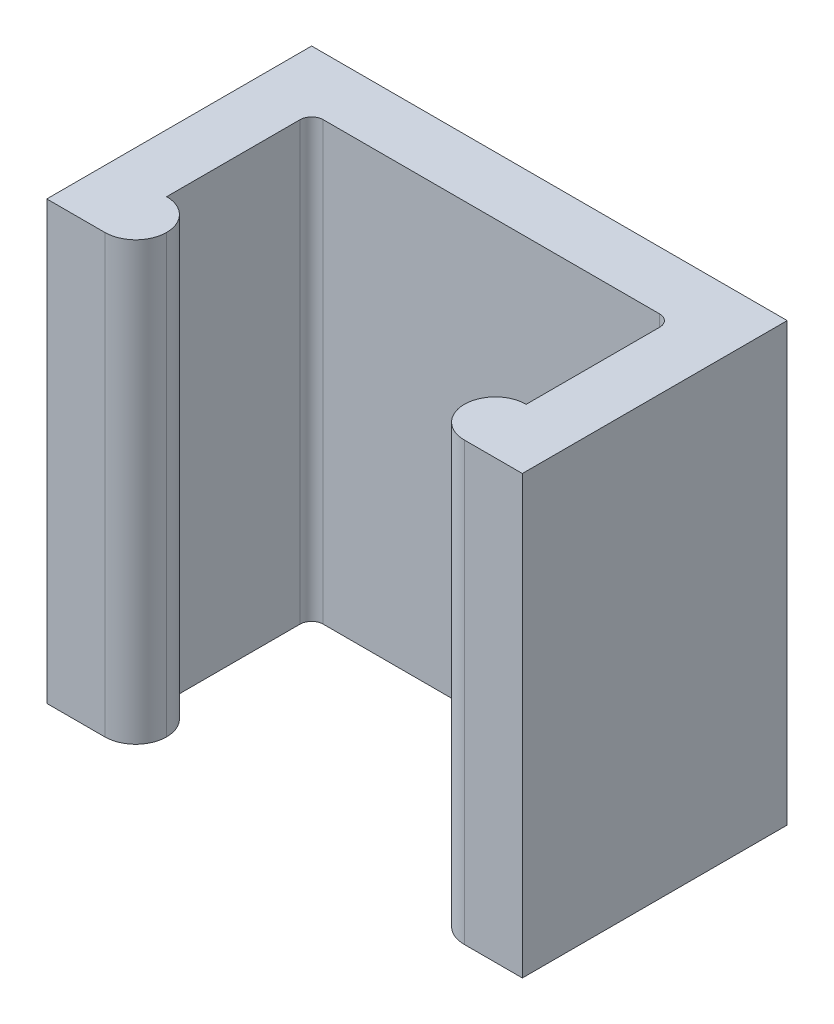
ISO-10303-21;
HEADER;
FILE_DESCRIPTION(('STEP AP214'),'2;1');
FILE_NAME('part.step','',(''),(''),'','','');
FILE_SCHEMA(('AUTOMOTIVE_DESIGN { 1 0 10303 214 1 1 1 1 }'));
ENDSEC;
DATA;
#1=APPLICATION_CONTEXT('core data for automotive mechanical design processes');
#2=APPLICATION_PROTOCOL_DEFINITION('international standard','automotive_design',2000,#1);
#3=PRODUCT_CONTEXT('',#1,'mechanical');
#4=PRODUCT('Part','Part','',(#3));
#5=PRODUCT_RELATED_PRODUCT_CATEGORY('part','',(#4));
#6=PRODUCT_DEFINITION_FORMATION('','',#4);
#7=PRODUCT_DEFINITION_CONTEXT('part definition',#1,'design');
#8=PRODUCT_DEFINITION('design','',#6,#7);
#9=PRODUCT_DEFINITION_SHAPE('','',#8);
#10=(LENGTH_UNIT() NAMED_UNIT(*) SI_UNIT(.MILLI.,.METRE.));
#11=(NAMED_UNIT(*) PLANE_ANGLE_UNIT() SI_UNIT($,.RADIAN.));
#12=(NAMED_UNIT(*) SI_UNIT($,.STERADIAN.) SOLID_ANGLE_UNIT());
#13=UNCERTAINTY_MEASURE_WITH_UNIT(LENGTH_MEASURE(1.E-05),#10,'distance_accuracy_value','');
#14=(GEOMETRIC_REPRESENTATION_CONTEXT(3) GLOBAL_UNCERTAINTY_ASSIGNED_CONTEXT((#13)) GLOBAL_UNIT_ASSIGNED_CONTEXT((#10,
#11,#12)) REPRESENTATION_CONTEXT('',''));
#15=CARTESIAN_POINT('',(0.,0.,0.));
#16=DIRECTION('',(0.,0.,1.));
#17=DIRECTION('',(1.,0.,0.));
#18=AXIS2_PLACEMENT_3D('',#15,#16,#17);
#19=CARTESIAN_POINT('',(4.65,5.65,6.85));
#20=DIRECTION('',(1.,0.,0.));
#21=DIRECTION('',(0.,1.,0.));
#22=AXIS2_PLACEMENT_3D('',#19,#20,#21);
#23=PLANE('',#22);
#24=DIRECTION('',(0.,0.,-1.));
#25=VECTOR('',#24,1.);
#26=CARTESIAN_POINT('',(4.65,5.65,6.85));
#27=LINE('',#26,#25);
#28=CARTESIAN_POINT('',(4.65,5.65,5.25));
#29=VERTEX_POINT('',#28);
#30=CARTESIAN_POINT('',(4.65,5.65,1.8));
#31=VERTEX_POINT('',#30);
#32=EDGE_CURVE('E146',#29,#31,#27,.T.);
#33=ORIENTED_EDGE('',*,*,#32,.T.);
#34=DIRECTION('',(0.,1.,0.));
#35=VECTOR('',#34,1.);
#36=CARTESIAN_POINT('',(4.65,-5.65,1.8));
#37=LINE('',#36,#35);
#38=CARTESIAN_POINT('',(4.65,-5.65,1.8));
#39=VERTEX_POINT('',#38);
#40=EDGE_CURVE('E214',#31,#39,#37,.F.);
#41=ORIENTED_EDGE('',*,*,#40,.T.);
#42=DIRECTION('',(0.,0.,-1.));
#43=VECTOR('',#42,1.);
#44=CARTESIAN_POINT('',(4.65,-5.65,6.85));
#45=LINE('',#44,#43);
#46=CARTESIAN_POINT('',(4.65,-5.65,5.25));
#47=VERTEX_POINT('',#46);
#48=EDGE_CURVE('E149',#47,#39,#45,.T.);
#49=ORIENTED_EDGE('',*,*,#48,.F.);
#50=DIRECTION('',(0.,-1.,0.));
#51=VECTOR('',#50,1.);
#52=CARTESIAN_POINT('',(4.65,-5.65,5.25));
#53=LINE('',#52,#51);
#54=EDGE_CURVE('E144',#29,#47,#53,.T.);
#55=ORIENTED_EDGE('',*,*,#54,.F.);
#56=EDGE_LOOP('',(#33,#41,#49,#55));
#57=FACE_BOUND('',#56,.T.);
#58=ADVANCED_FACE('F41',(#57),#23,.F.);
#59=CARTESIAN_POINT('',(-4.65,5.65,6.85));
#60=DIRECTION('',(-1.,0.,0.));
#61=DIRECTION('',(0.,-1.,0.));
#62=AXIS2_PLACEMENT_3D('',#59,#60,#61);
#63=PLANE('',#62);
#64=DIRECTION('',(0.,0.,-1.));
#65=VECTOR('',#64,1.);
#66=CARTESIAN_POINT('',(-4.65,-5.65,6.85));
#67=LINE('',#66,#65);
#68=CARTESIAN_POINT('',(-4.65,-5.65,5.25));
#69=VERTEX_POINT('',#68);
#70=CARTESIAN_POINT('',(-4.65,-5.65,1.8));
#71=VERTEX_POINT('',#70);
#72=EDGE_CURVE('E326',#69,#71,#67,.T.);
#73=ORIENTED_EDGE('',*,*,#72,.T.);
#74=DIRECTION('',(0.,-1.,0.));
#75=VECTOR('',#74,1.);
#76=CARTESIAN_POINT('',(-4.65,5.65,1.8));
#77=LINE('',#76,#75);
#78=CARTESIAN_POINT('',(-4.65,5.65,1.8));
#79=VERTEX_POINT('',#78);
#80=EDGE_CURVE('E57',#71,#79,#77,.F.);
#81=ORIENTED_EDGE('',*,*,#80,.T.);
#82=DIRECTION('',(0.,0.,-1.));
#83=VECTOR('',#82,1.);
#84=CARTESIAN_POINT('',(-4.65,5.65,6.85));
#85=LINE('',#84,#83);
#86=CARTESIAN_POINT('',(-4.65,5.65,5.25));
#87=VERTEX_POINT('',#86);
#88=EDGE_CURVE('E323',#87,#79,#85,.T.);
#89=ORIENTED_EDGE('',*,*,#88,.F.);
#90=DIRECTION('',(0.,1.,0.));
#91=VECTOR('',#90,1.);
#92=CARTESIAN_POINT('',(-4.65,5.65,5.25));
#93=LINE('',#92,#91);
#94=EDGE_CURVE('E154',#69,#87,#93,.T.);
#95=ORIENTED_EDGE('',*,*,#94,.F.);
#96=EDGE_LOOP('',(#73,#81,#89,#95));
#97=FACE_BOUND('',#96,.T.);
#98=ADVANCED_FACE('F251',(#97),#63,.F.);
#99=CARTESIAN_POINT('',(6.15,-5.65,2.5));
#100=DIRECTION('',(-1.,0.,0.));
#101=DIRECTION('',(0.,0.,1.));
#102=AXIS2_PLACEMENT_3D('',#99,#100,#101);
#103=PLANE('',#102);
#104=DIRECTION('',(0.,1.,0.));
#105=VECTOR('',#104,1.);
#106=CARTESIAN_POINT('',(6.15,-5.65,0.));
#107=LINE('',#106,#105);
#108=CARTESIAN_POINT('',(6.15,-5.65,0.));
#109=VERTEX_POINT('',#108);
#110=CARTESIAN_POINT('',(6.15,5.65,0.));
#111=VERTEX_POINT('',#110);
#112=EDGE_CURVE('E329',#109,#111,#107,.T.);
#113=ORIENTED_EDGE('',*,*,#112,.T.);
#114=DIRECTION('',(0.,0.,-1.));
#115=VECTOR('',#114,1.);
#116=CARTESIAN_POINT('',(6.15,5.65,2.5));
#117=LINE('',#116,#115);
#118=CARTESIAN_POINT('',(6.15,5.65,6.85));
#119=VERTEX_POINT('',#118);
#120=EDGE_CURVE('E236',#119,#111,#117,.T.);
#121=ORIENTED_EDGE('',*,*,#120,.F.);
#122=DIRECTION('',(0.,1.,0.));
#123=VECTOR('',#122,1.);
#124=CARTESIAN_POINT('',(6.15,5.65,6.85));
#125=LINE('',#124,#123);
#126=CARTESIAN_POINT('',(6.15,-5.65,6.85));
#127=VERTEX_POINT('',#126);
#128=EDGE_CURVE('E298',#127,#119,#125,.T.);
#129=ORIENTED_EDGE('',*,*,#128,.F.);
#130=DIRECTION('',(0.,0.,-1.));
#131=VECTOR('',#130,1.);
#132=CARTESIAN_POINT('',(6.15,-5.65,2.5));
#133=LINE('',#132,#131);
#134=EDGE_CURVE('E342',#127,#109,#133,.T.);
#135=ORIENTED_EDGE('',*,*,#134,.T.);
#136=EDGE_LOOP('',(#113,#121,#129,#135));
#137=FACE_BOUND('',#136,.T.);
#138=ADVANCED_FACE('F256',(#137),#103,.F.);
#139=CARTESIAN_POINT('',(-6.15,5.65,2.5));
#140=DIRECTION('',(0.,-1.,0.));
#141=DIRECTION('',(0.,0.,-1.));
#142=AXIS2_PLACEMENT_3D('',#139,#140,#141);
#143=PLANE('',#142);
#144=CARTESIAN_POINT('',(4.65,5.65,6.05));
#145=DIRECTION('',(0.,-1.,0.));
#146=DIRECTION('',(0.,0.,-1.));
#147=AXIS2_PLACEMENT_3D('',#144,#145,#146);
#148=CIRCLE('',#147,0.8);
#149=CARTESIAN_POINT('',(3.85,5.65,6.05));
#150=VERTEX_POINT('',#149);
#151=EDGE_CURVE('E159',#29,#150,#148,.F.);
#152=ORIENTED_EDGE('',*,*,#151,.T.);
#153=CARTESIAN_POINT('',(4.65,5.65,6.05));
#154=DIRECTION('',(0.,-1.,0.));
#155=DIRECTION('',(0.,0.,-1.));
#156=AXIS2_PLACEMENT_3D('',#153,#154,#155);
#157=CIRCLE('',#156,0.8);
#158=CARTESIAN_POINT('',(4.65,5.65,6.85));
#159=VERTEX_POINT('',#158);
#160=EDGE_CURVE('E170',#150,#159,#157,.F.);
#161=ORIENTED_EDGE('',*,*,#160,.T.);
#162=DIRECTION('',(-1.,0.,0.));
#163=VECTOR('',#162,1.);
#164=CARTESIAN_POINT('',(6.15,5.65,6.85));
#165=LINE('',#164,#163);
#166=EDGE_CURVE('E304',#119,#159,#165,.T.);
#167=ORIENTED_EDGE('',*,*,#166,.F.);
#168=ORIENTED_EDGE('',*,*,#120,.T.);
#169=DIRECTION('',(-1.,0.,0.));
#170=VECTOR('',#169,1.);
#171=CARTESIAN_POINT('',(-6.15,5.65,0.));
#172=LINE('',#171,#170);
#173=CARTESIAN_POINT('',(-6.15,5.65,0.));
#174=VERTEX_POINT('',#173);
#175=EDGE_CURVE('E333',#111,#174,#172,.T.);
#176=ORIENTED_EDGE('',*,*,#175,.T.);
#177=DIRECTION('',(0.,0.,-1.));
#178=VECTOR('',#177,1.);
#179=CARTESIAN_POINT('',(-6.15,5.65,2.5));
#180=LINE('',#179,#178);
#181=CARTESIAN_POINT('',(-6.15,5.65,6.85));
#182=VERTEX_POINT('',#181);
#183=EDGE_CURVE('E350',#182,#174,#180,.T.);
#184=ORIENTED_EDGE('',*,*,#183,.F.);
#185=DIRECTION('',(-1.,0.,0.));
#186=VECTOR('',#185,1.);
#187=CARTESIAN_POINT('',(-6.15,5.65,6.85));
#188=LINE('',#187,#186);
#189=CARTESIAN_POINT('',(-4.65,5.65,6.85));
#190=VERTEX_POINT('',#189);
#191=EDGE_CURVE('E320',#190,#182,#188,.T.);
#192=ORIENTED_EDGE('',*,*,#191,.F.);
#193=CARTESIAN_POINT('',(-4.65,5.65,6.05));
#194=DIRECTION('',(0.,-1.,0.));
#195=DIRECTION('',(0.,0.,-1.));
#196=AXIS2_PLACEMENT_3D('',#193,#194,#195);
#197=CIRCLE('',#196,0.8);
#198=CARTESIAN_POINT('',(-3.85,5.65,6.05));
#199=VERTEX_POINT('',#198);
#200=EDGE_CURVE('E171',#190,#199,#197,.F.);
#201=ORIENTED_EDGE('',*,*,#200,.T.);
#202=CARTESIAN_POINT('',(-4.65,5.65,6.05));
#203=DIRECTION('',(0.,-1.,0.));
#204=DIRECTION('',(0.,0.,-1.));
#205=AXIS2_PLACEMENT_3D('',#202,#203,#204);
#206=CIRCLE('',#205,0.8);
#207=EDGE_CURVE('E177',#199,#87,#206,.F.);
#208=ORIENTED_EDGE('',*,*,#207,.T.);
#209=ORIENTED_EDGE('',*,*,#88,.T.);
#210=CARTESIAN_POINT('',(-4.35,5.65,1.8));
#211=DIRECTION('',(0.,-1.,0.));
#212=DIRECTION('',(0.,0.,-1.));
#213=AXIS2_PLACEMENT_3D('',#210,#211,#212);
#214=CIRCLE('',#213,0.3);
#215=CARTESIAN_POINT('',(-4.35,5.65,1.5));
#216=VERTEX_POINT('',#215);
#217=EDGE_CURVE('E11',#79,#216,#214,.T.);
#218=ORIENTED_EDGE('',*,*,#217,.T.);
#219=DIRECTION('',(1.,0.,0.));
#220=VECTOR('',#219,1.);
#221=CARTESIAN_POINT('',(-6.15,5.65,1.5));
#222=LINE('',#221,#220);
#223=CARTESIAN_POINT('',(4.35,5.65,1.5));
#224=VERTEX_POINT('',#223);
#225=EDGE_CURVE('E295',#216,#224,#222,.T.);
#226=ORIENTED_EDGE('',*,*,#225,.T.);
#227=CARTESIAN_POINT('',(4.35,5.65,1.8));
#228=DIRECTION('',(0.,-1.,0.));
#229=DIRECTION('',(0.,0.,-1.));
#230=AXIS2_PLACEMENT_3D('',#227,#228,#229);
#231=CIRCLE('',#230,0.3);
#232=EDGE_CURVE('E162',#224,#31,#231,.T.);
#233=ORIENTED_EDGE('',*,*,#232,.T.);
#234=ORIENTED_EDGE('',*,*,#32,.F.);
#235=EDGE_LOOP('',(#152,#161,#167,#168,#176,#184,#192,#201,#208,#209,#218,#226,#233,#234));
#236=FACE_BOUND('',#235,.T.);
#237=ADVANCED_FACE('F158',(#236),#143,.F.);
#238=CARTESIAN_POINT('',(-6.15,-5.65,2.5));
#239=DIRECTION('',(1.,0.,0.));
#240=DIRECTION('',(0.,0.,-1.));
#241=AXIS2_PLACEMENT_3D('',#238,#239,#240);
#242=PLANE('',#241);
#243=DIRECTION('',(0.,-1.,0.));
#244=VECTOR('',#243,1.);
#245=CARTESIAN_POINT('',(-6.15,-5.65,0.));
#246=LINE('',#245,#244);
#247=CARTESIAN_POINT('',(-6.15,-5.65,0.));
#248=VERTEX_POINT('',#247);
#249=EDGE_CURVE('E336',#174,#248,#246,.T.);
#250=ORIENTED_EDGE('',*,*,#249,.T.);
#251=DIRECTION('',(0.,0.,-1.));
#252=VECTOR('',#251,1.);
#253=CARTESIAN_POINT('',(-6.15,-5.65,2.5));
#254=LINE('',#253,#252);
#255=CARTESIAN_POINT('',(-6.15,-5.65,6.85));
#256=VERTEX_POINT('',#255);
#257=EDGE_CURVE('E346',#256,#248,#254,.T.);
#258=ORIENTED_EDGE('',*,*,#257,.F.);
#259=DIRECTION('',(0.,-1.,0.));
#260=VECTOR('',#259,1.);
#261=CARTESIAN_POINT('',(-6.15,5.65,6.85));
#262=LINE('',#261,#260);
#263=EDGE_CURVE('E164',#182,#256,#262,.T.);
#264=ORIENTED_EDGE('',*,*,#263,.F.);
#265=ORIENTED_EDGE('',*,*,#183,.T.);
#266=EDGE_LOOP('',(#250,#258,#264,#265));
#267=FACE_BOUND('',#266,.T.);
#268=ADVANCED_FACE('F272',(#267),#242,.F.);
#269=CARTESIAN_POINT('',(-6.15,-5.65,2.5));
#270=DIRECTION('',(0.,1.,0.));
#271=DIRECTION('',(0.,0.,1.));
#272=AXIS2_PLACEMENT_3D('',#269,#270,#271);
#273=PLANE('',#272);
#274=DIRECTION('',(1.,0.,0.));
#275=VECTOR('',#274,1.);
#276=CARTESIAN_POINT('',(6.15,-5.65,6.85));
#277=LINE('',#276,#275);
#278=CARTESIAN_POINT('',(4.65,-5.65,6.85));
#279=VERTEX_POINT('',#278);
#280=EDGE_CURVE('E308',#279,#127,#277,.T.);
#281=ORIENTED_EDGE('',*,*,#280,.F.);
#282=CARTESIAN_POINT('',(4.65,-5.65,6.05));
#283=DIRECTION('',(0.,1.,0.));
#284=DIRECTION('',(0.,0.,1.));
#285=AXIS2_PLACEMENT_3D('',#282,#283,#284);
#286=CIRCLE('',#285,0.8);
#287=CARTESIAN_POINT('',(3.85,-5.65,6.05));
#288=VERTEX_POINT('',#287);
#289=EDGE_CURVE('E193',#279,#288,#286,.F.);
#290=ORIENTED_EDGE('',*,*,#289,.T.);
#291=CARTESIAN_POINT('',(4.65,-5.65,6.05));
#292=DIRECTION('',(0.,1.,0.));
#293=DIRECTION('',(0.,0.,1.));
#294=AXIS2_PLACEMENT_3D('',#291,#292,#293);
#295=CIRCLE('',#294,0.8);
#296=EDGE_CURVE('E190',#288,#47,#295,.F.);
#297=ORIENTED_EDGE('',*,*,#296,.T.);
#298=ORIENTED_EDGE('',*,*,#48,.T.);
#299=CARTESIAN_POINT('',(4.35,-5.65,1.8));
#300=DIRECTION('',(0.,1.,0.));
#301=DIRECTION('',(0.,0.,1.));
#302=AXIS2_PLACEMENT_3D('',#299,#300,#301);
#303=CIRCLE('',#302,0.3);
#304=CARTESIAN_POINT('',(4.35,-5.65,1.5));
#305=VERTEX_POINT('',#304);
#306=EDGE_CURVE('E221',#39,#305,#303,.T.);
#307=ORIENTED_EDGE('',*,*,#306,.T.);
#308=DIRECTION('',(-1.,0.,0.));
#309=VECTOR('',#308,1.);
#310=CARTESIAN_POINT('',(-6.15,-5.65,1.5));
#311=LINE('',#310,#309);
#312=CARTESIAN_POINT('',(-4.35,-5.65,1.5));
#313=VERTEX_POINT('',#312);
#314=EDGE_CURVE('E228',#305,#313,#311,.T.);
#315=ORIENTED_EDGE('',*,*,#314,.T.);
#316=CARTESIAN_POINT('',(-4.35,-5.65,1.8));
#317=DIRECTION('',(0.,1.,0.));
#318=DIRECTION('',(0.,0.,1.));
#319=AXIS2_PLACEMENT_3D('',#316,#317,#318);
#320=CIRCLE('',#319,0.3);
#321=EDGE_CURVE('E50',#313,#71,#320,.T.);
#322=ORIENTED_EDGE('',*,*,#321,.T.);
#323=ORIENTED_EDGE('',*,*,#72,.F.);
#324=CARTESIAN_POINT('',(-4.65,-5.65,6.05));
#325=DIRECTION('',(0.,1.,0.));
#326=DIRECTION('',(0.,0.,1.));
#327=AXIS2_PLACEMENT_3D('',#324,#325,#326);
#328=CIRCLE('',#327,0.8);
#329=CARTESIAN_POINT('',(-3.85,-5.65,6.05));
#330=VERTEX_POINT('',#329);
#331=EDGE_CURVE('E184',#69,#330,#328,.F.);
#332=ORIENTED_EDGE('',*,*,#331,.T.);
#333=CARTESIAN_POINT('',(-4.65,-5.65,6.05));
#334=DIRECTION('',(0.,1.,0.));
#335=DIRECTION('',(0.,0.,1.));
#336=AXIS2_PLACEMENT_3D('',#333,#334,#335);
#337=CIRCLE('',#336,0.8);
#338=CARTESIAN_POINT('',(-4.65,-5.65,6.85));
#339=VERTEX_POINT('',#338);
#340=EDGE_CURVE('E187',#330,#339,#337,.F.);
#341=ORIENTED_EDGE('',*,*,#340,.T.);
#342=DIRECTION('',(1.,0.,0.));
#343=VECTOR('',#342,1.);
#344=CARTESIAN_POINT('',(-6.15,-5.65,6.85));
#345=LINE('',#344,#343);
#346=EDGE_CURVE('E316',#256,#339,#345,.T.);
#347=ORIENTED_EDGE('',*,*,#346,.F.);
#348=ORIENTED_EDGE('',*,*,#257,.T.);
#349=DIRECTION('',(1.,0.,0.));
#350=VECTOR('',#349,1.);
#351=CARTESIAN_POINT('',(-6.15,-5.65,0.));
#352=LINE('',#351,#350);
#353=EDGE_CURVE('E339',#248,#109,#352,.T.);
#354=ORIENTED_EDGE('',*,*,#353,.T.);
#355=ORIENTED_EDGE('',*,*,#134,.F.);
#356=EDGE_LOOP('',(#281,#290,#297,#298,#307,#315,#322,#323,#332,#341,#347,#348,#354,#355));
#357=FACE_BOUND('',#356,.T.);
#358=ADVANCED_FACE('F227',(#357),#273,.F.);
#359=CARTESIAN_POINT('',(0.,0.,0.));
#360=DIRECTION('',(0.,0.,-1.));
#361=DIRECTION('',(-1.,0.,0.));
#362=AXIS2_PLACEMENT_3D('',#359,#360,#361);
#363=PLANE('',#362);
#364=ORIENTED_EDGE('',*,*,#112,.F.);
#365=ORIENTED_EDGE('',*,*,#353,.F.);
#366=ORIENTED_EDGE('',*,*,#249,.F.);
#367=ORIENTED_EDGE('',*,*,#175,.F.);
#368=EDGE_LOOP('',(#364,#365,#366,#367));
#369=FACE_BOUND('',#368,.T.);
#370=ADVANCED_FACE('F264',(#369),#363,.T.);
#371=CARTESIAN_POINT('',(0.,0.,6.85));
#372=DIRECTION('',(0.,0.,1.));
#373=DIRECTION('',(1.,0.,0.));
#374=AXIS2_PLACEMENT_3D('',#371,#372,#373);
#375=PLANE('',#374);
#376=ORIENTED_EDGE('',*,*,#346,.T.);
#377=DIRECTION('',(0.,-1.,0.));
#378=VECTOR('',#377,1.);
#379=CARTESIAN_POINT('',(-4.65,0.,6.85));
#380=LINE('',#379,#378);
#381=EDGE_CURVE('E196',#339,#190,#380,.F.);
#382=ORIENTED_EDGE('',*,*,#381,.T.);
#383=ORIENTED_EDGE('',*,*,#191,.T.);
#384=ORIENTED_EDGE('',*,*,#263,.T.);
#385=EDGE_LOOP('',(#376,#382,#383,#384));
#386=FACE_BOUND('',#385,.T.);
#387=ADVANCED_FACE('F262',(#386),#375,.T.);
#388=CARTESIAN_POINT('',(0.,0.,6.85));
#389=DIRECTION('',(0.,0.,-1.));
#390=DIRECTION('',(-1.,0.,0.));
#391=AXIS2_PLACEMENT_3D('',#388,#389,#390);
#392=PLANE('',#391);
#393=ORIENTED_EDGE('',*,*,#166,.T.);
#394=DIRECTION('',(0.,1.,0.));
#395=VECTOR('',#394,1.);
#396=CARTESIAN_POINT('',(4.65,-5.65,6.85));
#397=LINE('',#396,#395);
#398=EDGE_CURVE('E175',#159,#279,#397,.F.);
#399=ORIENTED_EDGE('',*,*,#398,.T.);
#400=ORIENTED_EDGE('',*,*,#280,.T.);
#401=ORIENTED_EDGE('',*,*,#128,.T.);
#402=EDGE_LOOP('',(#393,#399,#400,#401));
#403=FACE_BOUND('',#402,.T.);
#404=ADVANCED_FACE('F260',(#403),#392,.F.);
#405=CARTESIAN_POINT('',(0.,0.,1.5));
#406=DIRECTION('',(0.,0.,-1.));
#407=DIRECTION('',(-1.,0.,0.));
#408=AXIS2_PLACEMENT_3D('',#405,#406,#407);
#409=PLANE('',#408);
#410=ORIENTED_EDGE('',*,*,#314,.F.);
#411=DIRECTION('',(0.,1.,0.));
#412=VECTOR('',#411,1.);
#413=CARTESIAN_POINT('',(4.35,5.65,1.5));
#414=LINE('',#413,#412);
#415=EDGE_CURVE('E210',#305,#224,#414,.T.);
#416=ORIENTED_EDGE('',*,*,#415,.T.);
#417=ORIENTED_EDGE('',*,*,#225,.F.);
#418=DIRECTION('',(0.,-1.,0.));
#419=VECTOR('',#418,1.);
#420=CARTESIAN_POINT('',(-4.35,-5.65,1.5));
#421=LINE('',#420,#419);
#422=EDGE_CURVE('E200',#216,#313,#421,.T.);
#423=ORIENTED_EDGE('',*,*,#422,.T.);
#424=EDGE_LOOP('',(#410,#416,#417,#423));
#425=FACE_BOUND('',#424,.T.);
#426=ADVANCED_FACE('F232',(#425),#409,.F.);
#427=CARTESIAN_POINT('',(4.65,0.,6.05));
#428=DIRECTION('',(0.,1.,0.));
#429=DIRECTION('',(-1.,0.,0.));
#430=AXIS2_PLACEMENT_3D('',#427,#428,#429);
#431=CYLINDRICAL_SURFACE('',#430,0.8);
#432=ORIENTED_EDGE('',*,*,#54,.T.);
#433=ORIENTED_EDGE('',*,*,#296,.F.);
#434=DIRECTION('',(0.,-1.,0.));
#435=VECTOR('',#434,1.);
#436=CARTESIAN_POINT('',(3.85,-5.65,6.05));
#437=LINE('',#436,#435);
#438=EDGE_CURVE('E155',#150,#288,#437,.T.);
#439=ORIENTED_EDGE('',*,*,#438,.F.);
#440=ORIENTED_EDGE('',*,*,#151,.F.);
#441=EDGE_LOOP('',(#432,#433,#439,#440));
#442=FACE_BOUND('',#441,.T.);
#443=ADVANCED_FACE('F166',(#442),#431,.T.);
#444=CARTESIAN_POINT('',(4.65,0.,6.05));
#445=DIRECTION('',(0.,-1.,0.));
#446=DIRECTION('',(1.,0.,0.));
#447=AXIS2_PLACEMENT_3D('',#444,#445,#446);
#448=CYLINDRICAL_SURFACE('',#447,0.8);
#449=ORIENTED_EDGE('',*,*,#289,.F.);
#450=ORIENTED_EDGE('',*,*,#398,.F.);
#451=ORIENTED_EDGE('',*,*,#160,.F.);
#452=ORIENTED_EDGE('',*,*,#438,.T.);
#453=EDGE_LOOP('',(#449,#450,#451,#452));
#454=FACE_BOUND('',#453,.T.);
#455=ADVANCED_FACE('F281',(#454),#448,.T.);
#456=CARTESIAN_POINT('',(-4.65,0.,6.05));
#457=DIRECTION('',(0.,-1.,0.));
#458=DIRECTION('',(1.,0.,0.));
#459=AXIS2_PLACEMENT_3D('',#456,#457,#458);
#460=CYLINDRICAL_SURFACE('',#459,0.8);
#461=ORIENTED_EDGE('',*,*,#94,.T.);
#462=ORIENTED_EDGE('',*,*,#207,.F.);
#463=DIRECTION('',(0.,1.,0.));
#464=VECTOR('',#463,1.);
#465=CARTESIAN_POINT('',(-3.85,5.65,6.05));
#466=LINE('',#465,#464);
#467=EDGE_CURVE('E203',#330,#199,#466,.T.);
#468=ORIENTED_EDGE('',*,*,#467,.F.);
#469=ORIENTED_EDGE('',*,*,#331,.F.);
#470=EDGE_LOOP('',(#461,#462,#468,#469));
#471=FACE_BOUND('',#470,.T.);
#472=ADVANCED_FACE('F246',(#471),#460,.T.);
#473=CARTESIAN_POINT('',(-4.65,0.,6.05));
#474=DIRECTION('',(0.,-1.,0.));
#475=DIRECTION('',(1.,0.,0.));
#476=AXIS2_PLACEMENT_3D('',#473,#474,#475);
#477=CYLINDRICAL_SURFACE('',#476,0.8);
#478=ORIENTED_EDGE('',*,*,#200,.F.);
#479=ORIENTED_EDGE('',*,*,#381,.F.);
#480=ORIENTED_EDGE('',*,*,#340,.F.);
#481=ORIENTED_EDGE('',*,*,#467,.T.);
#482=EDGE_LOOP('',(#478,#479,#480,#481));
#483=FACE_BOUND('',#482,.T.);
#484=ADVANCED_FACE('F240',(#483),#477,.T.);
#485=CARTESIAN_POINT('',(4.35,0.,1.8));
#486=DIRECTION('',(0.,-1.,0.));
#487=DIRECTION('',(1.,0.,0.));
#488=AXIS2_PLACEMENT_3D('',#485,#486,#487);
#489=CYLINDRICAL_SURFACE('',#488,0.3);
#490=ORIENTED_EDGE('',*,*,#306,.F.);
#491=ORIENTED_EDGE('',*,*,#40,.F.);
#492=ORIENTED_EDGE('',*,*,#232,.F.);
#493=ORIENTED_EDGE('',*,*,#415,.F.);
#494=EDGE_LOOP('',(#490,#491,#492,#493));
#495=FACE_BOUND('',#494,.T.);
#496=ADVANCED_FACE('F238',(#495),#489,.F.);
#497=CARTESIAN_POINT('',(-4.35,0.,1.8));
#498=DIRECTION('',(0.,1.,0.));
#499=DIRECTION('',(-1.,0.,0.));
#500=AXIS2_PLACEMENT_3D('',#497,#498,#499);
#501=CYLINDRICAL_SURFACE('',#500,0.3);
#502=ORIENTED_EDGE('',*,*,#217,.F.);
#503=ORIENTED_EDGE('',*,*,#80,.F.);
#504=ORIENTED_EDGE('',*,*,#321,.F.);
#505=ORIENTED_EDGE('',*,*,#422,.F.);
#506=EDGE_LOOP('',(#502,#503,#504,#505));
#507=FACE_BOUND('',#506,.T.);
#508=ADVANCED_FACE('F43',(#507),#501,.F.);
#509=CLOSED_SHELL('',(#58,#98,#138,#237,#268,#358,#370,#387,#404,#426,#443,#455,#472,#484,#496,#508));
#510=MANIFOLD_SOLID_BREP('B2',#509);
#511=ADVANCED_BREP_SHAPE_REPRESENTATION('',(#18,#510),#14);
#512=SHAPE_DEFINITION_REPRESENTATION(#9,#511);
ENDSEC;
END-ISO-10303-21;
